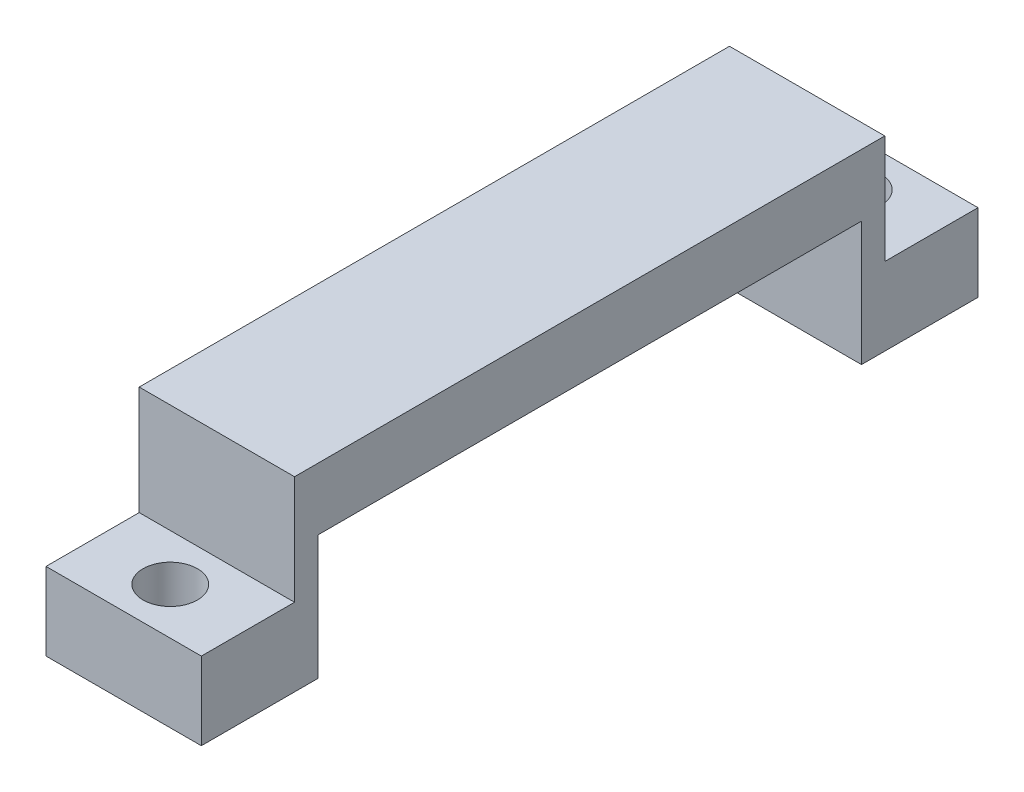
ISO-10303-21;
HEADER;
FILE_DESCRIPTION(('STEP AP214'),'2;1');
FILE_NAME('part.step','',(''),(''),'','','');
FILE_SCHEMA(('AUTOMOTIVE_DESIGN { 1 0 10303 214 1 1 1 1 }'));
ENDSEC;
DATA;
#1=APPLICATION_CONTEXT('core data for automotive mechanical design processes');
#2=APPLICATION_PROTOCOL_DEFINITION('international standard','automotive_design',2000,#1);
#3=PRODUCT_CONTEXT('',#1,'mechanical');
#4=PRODUCT('Part','Part','',(#3));
#5=PRODUCT_RELATED_PRODUCT_CATEGORY('part','',(#4));
#6=PRODUCT_DEFINITION_FORMATION('','',#4);
#7=PRODUCT_DEFINITION_CONTEXT('part definition',#1,'design');
#8=PRODUCT_DEFINITION('design','',#6,#7);
#9=PRODUCT_DEFINITION_SHAPE('','',#8);
#10=(LENGTH_UNIT() NAMED_UNIT(*) SI_UNIT(.MILLI.,.METRE.));
#11=(NAMED_UNIT(*) PLANE_ANGLE_UNIT() SI_UNIT($,.RADIAN.));
#12=(NAMED_UNIT(*) SI_UNIT($,.STERADIAN.) SOLID_ANGLE_UNIT());
#13=UNCERTAINTY_MEASURE_WITH_UNIT(LENGTH_MEASURE(1.E-05),#10,'distance_accuracy_value','');
#14=(GEOMETRIC_REPRESENTATION_CONTEXT(3) GLOBAL_UNCERTAINTY_ASSIGNED_CONTEXT((#13)) GLOBAL_UNIT_ASSIGNED_CONTEXT((#10,
#11,#12)) REPRESENTATION_CONTEXT('',''));
#15=CARTESIAN_POINT('',(0.,0.,0.));
#16=DIRECTION('',(0.,0.,1.));
#17=DIRECTION('',(1.,0.,0.));
#18=AXIS2_PLACEMENT_3D('',#15,#16,#17);
#19=CARTESIAN_POINT('',(20.,12.,25.));
#20=DIRECTION('',(-1.,0.,0.));
#21=DIRECTION('',(0.,0.,1.));
#22=AXIS2_PLACEMENT_3D('',#19,#20,#21);
#23=PLANE('',#22);
#24=DIRECTION('',(0.,1.,0.));
#25=VECTOR('',#24,1.);
#26=CARTESIAN_POINT('',(20.,5.,19.));
#27=LINE('',#26,#25);
#28=CARTESIAN_POINT('',(20.,5.,19.));
#29=VERTEX_POINT('',#28);
#30=CARTESIAN_POINT('',(20.,12.,19.));
#31=VERTEX_POINT('',#30);
#32=EDGE_CURVE('E201',#29,#31,#27,.T.);
#33=ORIENTED_EDGE('',*,*,#32,.F.);
#34=DIRECTION('',(0.,0.,-1.));
#35=VECTOR('',#34,1.);
#36=CARTESIAN_POINT('',(20.,5.,25.));
#37=LINE('',#36,#35);
#38=CARTESIAN_POINT('',(20.,5.,25.));
#39=VERTEX_POINT('',#38);
#40=EDGE_CURVE('E140',#39,#29,#37,.T.);
#41=ORIENTED_EDGE('',*,*,#40,.F.);
#42=DIRECTION('',(0.,-1.,0.));
#43=VECTOR('',#42,1.);
#44=CARTESIAN_POINT('',(20.,12.,25.));
#45=LINE('',#44,#43);
#46=CARTESIAN_POINT('',(20.,0.,25.));
#47=VERTEX_POINT('',#46);
#48=EDGE_CURVE('E139',#39,#47,#45,.T.);
#49=ORIENTED_EDGE('',*,*,#48,.T.);
#50=DIRECTION('',(0.,0.,-1.));
#51=VECTOR('',#50,1.);
#52=CARTESIAN_POINT('',(20.,0.,25.));
#53=LINE('',#52,#51);
#54=CARTESIAN_POINT('',(20.,0.,17.5));
#55=VERTEX_POINT('',#54);
#56=EDGE_CURVE('E177',#47,#55,#53,.T.);
#57=ORIENTED_EDGE('',*,*,#56,.T.);
#58=DIRECTION('',(0.,1.,0.));
#59=VECTOR('',#58,1.);
#60=CARTESIAN_POINT('',(20.,0.,17.5));
#61=LINE('',#60,#59);
#62=CARTESIAN_POINT('',(20.,8.,17.5));
#63=VERTEX_POINT('',#62);
#64=EDGE_CURVE('E160',#55,#63,#61,.T.);
#65=ORIENTED_EDGE('',*,*,#64,.T.);
#66=DIRECTION('',(0.,0.,-1.));
#67=VECTOR('',#66,1.);
#68=CARTESIAN_POINT('',(20.,8.,17.5));
#69=LINE('',#68,#67);
#70=CARTESIAN_POINT('',(20.,8.,-17.5));
#71=VERTEX_POINT('',#70);
#72=EDGE_CURVE('E163',#63,#71,#69,.T.);
#73=ORIENTED_EDGE('',*,*,#72,.T.);
#74=DIRECTION('',(0.,1.,0.));
#75=VECTOR('',#74,1.);
#76=CARTESIAN_POINT('',(20.,0.,-17.5));
#77=LINE('',#76,#75);
#78=CARTESIAN_POINT('',(20.,0.,-17.5));
#79=VERTEX_POINT('',#78);
#80=EDGE_CURVE('E166',#79,#71,#77,.T.);
#81=ORIENTED_EDGE('',*,*,#80,.F.);
#82=CARTESIAN_POINT('',(20.,0.,-25.));
#83=VERTEX_POINT('',#82);
#84=EDGE_CURVE('E173',#79,#83,#53,.T.);
#85=ORIENTED_EDGE('',*,*,#84,.T.);
#86=DIRECTION('',(0.,-1.,0.));
#87=VECTOR('',#86,1.);
#88=CARTESIAN_POINT('',(20.,12.,-25.));
#89=LINE('',#88,#87);
#90=CARTESIAN_POINT('',(20.,5.,-25.));
#91=VERTEX_POINT('',#90);
#92=EDGE_CURVE('E185',#91,#83,#89,.T.);
#93=ORIENTED_EDGE('',*,*,#92,.F.);
#94=DIRECTION('',(0.,0.,1.));
#95=VECTOR('',#94,1.);
#96=CARTESIAN_POINT('',(20.,5.,-25.));
#97=LINE('',#96,#95);
#98=CARTESIAN_POINT('',(20.,5.,-19.));
#99=VERTEX_POINT('',#98);
#100=EDGE_CURVE('E216',#91,#99,#97,.T.);
#101=ORIENTED_EDGE('',*,*,#100,.T.);
#102=DIRECTION('',(0.,1.,0.));
#103=VECTOR('',#102,1.);
#104=CARTESIAN_POINT('',(20.,5.,-19.));
#105=LINE('',#104,#103);
#106=CARTESIAN_POINT('',(20.,12.,-19.));
#107=VERTEX_POINT('',#106);
#108=EDGE_CURVE('E151',#99,#107,#105,.T.);
#109=ORIENTED_EDGE('',*,*,#108,.T.);
#110=DIRECTION('',(0.,0.,-1.));
#111=VECTOR('',#110,1.);
#112=CARTESIAN_POINT('',(20.,12.,25.));
#113=LINE('',#112,#111);
#114=EDGE_CURVE('E174',#31,#107,#113,.T.);
#115=ORIENTED_EDGE('',*,*,#114,.F.);
#116=EDGE_LOOP('',(#33,#41,#49,#57,#65,#73,#81,#85,#93,#101,#109,#115));
#117=FACE_BOUND('',#116,.T.);
#118=ADVANCED_FACE('F33',(#117),#23,.F.);
#119=CARTESIAN_POINT('',(-20.,12.,25.));
#120=DIRECTION('',(0.,0.,-1.));
#121=DIRECTION('',(-1.,0.,0.));
#122=AXIS2_PLACEMENT_3D('',#119,#120,#121);
#123=PLANE('',#122);
#124=DIRECTION('',(1.,0.,0.));
#125=VECTOR('',#124,1.);
#126=CARTESIAN_POINT('',(9.99999999999998,5.,25.));
#127=LINE('',#126,#125);
#128=CARTESIAN_POINT('',(9.99999999999998,5.,25.));
#129=VERTEX_POINT('',#128);
#130=EDGE_CURVE('E125',#129,#39,#127,.T.);
#131=ORIENTED_EDGE('',*,*,#130,.F.);
#132=DIRECTION('',(0.,1.,0.));
#133=VECTOR('',#132,1.);
#134=CARTESIAN_POINT('',(9.99999999999999,-53.,25.));
#135=LINE('',#134,#133);
#136=CARTESIAN_POINT('',(9.99999999999999,0.,25.));
#137=VERTEX_POINT('',#136);
#138=EDGE_CURVE('E137',#137,#129,#135,.T.);
#139=ORIENTED_EDGE('',*,*,#138,.F.);
#140=DIRECTION('',(1.,0.,0.));
#141=VECTOR('',#140,1.);
#142=CARTESIAN_POINT('',(-20.,0.,25.));
#143=LINE('',#142,#141);
#144=EDGE_CURVE('E176',#137,#47,#143,.T.);
#145=ORIENTED_EDGE('',*,*,#144,.T.);
#146=ORIENTED_EDGE('',*,*,#48,.F.);
#147=EDGE_LOOP('',(#131,#139,#145,#146));
#148=FACE_BOUND('',#147,.T.);
#149=ADVANCED_FACE('F135',(#148),#123,.F.);
#150=CARTESIAN_POINT('',(0.,12.,0.));
#151=DIRECTION('',(0.,-1.,0.));
#152=DIRECTION('',(0.,0.,-1.));
#153=AXIS2_PLACEMENT_3D('',#150,#151,#152);
#154=PLANE('',#153);
#155=DIRECTION('',(1.,0.,0.));
#156=VECTOR('',#155,1.);
#157=CARTESIAN_POINT('',(9.99999999999998,12.,19.));
#158=LINE('',#157,#156);
#159=CARTESIAN_POINT('',(9.99999999999998,12.,19.));
#160=VERTEX_POINT('',#159);
#161=EDGE_CURVE('E130',#160,#31,#158,.T.);
#162=ORIENTED_EDGE('',*,*,#161,.T.);
#163=ORIENTED_EDGE('',*,*,#114,.T.);
#164=DIRECTION('',(1.,0.,0.));
#165=VECTOR('',#164,1.);
#166=CARTESIAN_POINT('',(9.99999999999998,12.,-19.));
#167=LINE('',#166,#165);
#168=CARTESIAN_POINT('',(9.99999999999998,12.,-19.));
#169=VERTEX_POINT('',#168);
#170=EDGE_CURVE('E209',#169,#107,#167,.T.);
#171=ORIENTED_EDGE('',*,*,#170,.F.);
#172=DIRECTION('',(0.,0.,-1.));
#173=VECTOR('',#172,1.);
#174=CARTESIAN_POINT('',(9.99999999999998,12.,-25.));
#175=LINE('',#174,#173);
#176=EDGE_CURVE('E146',#160,#169,#175,.T.);
#177=ORIENTED_EDGE('',*,*,#176,.F.);
#178=EDGE_LOOP('',(#162,#163,#171,#177));
#179=FACE_BOUND('',#178,.T.);
#180=ADVANCED_FACE('F232',(#179),#154,.F.);
#181=CARTESIAN_POINT('',(9.99999999999998,-53.,-25.));
#182=DIRECTION('',(1.,0.,0.));
#183=DIRECTION('',(0.,0.,-1.));
#184=AXIS2_PLACEMENT_3D('',#181,#182,#183);
#185=PLANE('',#184);
#186=DIRECTION('',(0.,1.,0.));
#187=VECTOR('',#186,1.);
#188=CARTESIAN_POINT('',(9.99999999999998,5.,19.));
#189=LINE('',#188,#187);
#190=CARTESIAN_POINT('',(9.99999999999999,5.,19.));
#191=VERTEX_POINT('',#190);
#192=EDGE_CURVE('E47',#191,#160,#189,.T.);
#193=ORIENTED_EDGE('',*,*,#192,.T.);
#194=ORIENTED_EDGE('',*,*,#176,.T.);
#195=DIRECTION('',(0.,1.,0.));
#196=VECTOR('',#195,1.);
#197=CARTESIAN_POINT('',(9.99999999999998,5.,-19.));
#198=LINE('',#197,#196);
#199=CARTESIAN_POINT('',(9.99999999999998,5.,-19.));
#200=VERTEX_POINT('',#199);
#201=EDGE_CURVE('E220',#200,#169,#198,.T.);
#202=ORIENTED_EDGE('',*,*,#201,.F.);
#203=DIRECTION('',(0.,0.,1.));
#204=VECTOR('',#203,1.);
#205=CARTESIAN_POINT('',(9.99999999999998,5.,-25.));
#206=LINE('',#205,#204);
#207=CARTESIAN_POINT('',(9.99999999999998,5.,-25.));
#208=VERTEX_POINT('',#207);
#209=EDGE_CURVE('E211',#208,#200,#206,.T.);
#210=ORIENTED_EDGE('',*,*,#209,.F.);
#211=DIRECTION('',(0.,1.,0.));
#212=VECTOR('',#211,1.);
#213=CARTESIAN_POINT('',(9.99999999999998,-53.,-25.));
#214=LINE('',#213,#212);
#215=CARTESIAN_POINT('',(9.99999999999998,0.,-25.));
#216=VERTEX_POINT('',#215);
#217=EDGE_CURVE('E145',#216,#208,#214,.T.);
#218=ORIENTED_EDGE('',*,*,#217,.F.);
#219=DIRECTION('',(0.,0.,1.));
#220=VECTOR('',#219,1.);
#221=CARTESIAN_POINT('',(9.99999999999999,0.,0.));
#222=LINE('',#221,#220);
#223=CARTESIAN_POINT('',(9.99999999999998,0.,-17.5));
#224=VERTEX_POINT('',#223);
#225=EDGE_CURVE('E155',#216,#224,#222,.T.);
#226=ORIENTED_EDGE('',*,*,#225,.T.);
#227=DIRECTION('',(0.,-1.,0.));
#228=VECTOR('',#227,1.);
#229=CARTESIAN_POINT('',(9.99999999999998,0.,-17.5));
#230=LINE('',#229,#228);
#231=CARTESIAN_POINT('',(9.99999999999998,8.,-17.5));
#232=VERTEX_POINT('',#231);
#233=EDGE_CURVE('E11',#232,#224,#230,.T.);
#234=ORIENTED_EDGE('',*,*,#233,.F.);
#235=DIRECTION('',(0.,0.,1.));
#236=VECTOR('',#235,1.);
#237=CARTESIAN_POINT('',(9.99999999999999,8.,17.5));
#238=LINE('',#237,#236);
#239=CARTESIAN_POINT('',(9.99999999999999,8.,17.5));
#240=VERTEX_POINT('',#239);
#241=EDGE_CURVE('E149',#232,#240,#238,.T.);
#242=ORIENTED_EDGE('',*,*,#241,.T.);
#243=DIRECTION('',(0.,-1.,0.));
#244=VECTOR('',#243,1.);
#245=CARTESIAN_POINT('',(9.99999999999999,0.,17.5));
#246=LINE('',#245,#244);
#247=CARTESIAN_POINT('',(9.99999999999999,0.,17.5));
#248=VERTEX_POINT('',#247);
#249=EDGE_CURVE('E157',#240,#248,#246,.T.);
#250=ORIENTED_EDGE('',*,*,#249,.T.);
#251=DIRECTION('',(0.,0.,1.));
#252=VECTOR('',#251,1.);
#253=CARTESIAN_POINT('',(9.99999999999999,0.,0.));
#254=LINE('',#253,#252);
#255=EDGE_CURVE('E144',#248,#137,#254,.T.);
#256=ORIENTED_EDGE('',*,*,#255,.T.);
#257=ORIENTED_EDGE('',*,*,#138,.T.);
#258=DIRECTION('',(0.,0.,-1.));
#259=VECTOR('',#258,1.);
#260=CARTESIAN_POINT('',(9.99999999999998,5.,25.));
#261=LINE('',#260,#259);
#262=EDGE_CURVE('E121',#129,#191,#261,.T.);
#263=ORIENTED_EDGE('',*,*,#262,.T.);
#264=EDGE_LOOP('',(#193,#194,#202,#210,#218,#226,#234,#242,#250,#256,#257,#263));
#265=FACE_BOUND('',#264,.T.);
#266=ADVANCED_FACE('F142',(#265),#185,.F.);
#267=CARTESIAN_POINT('',(-20.,12.,-25.));
#268=DIRECTION('',(0.,0.,1.));
#269=DIRECTION('',(1.,0.,0.));
#270=AXIS2_PLACEMENT_3D('',#267,#268,#269);
#271=PLANE('',#270);
#272=DIRECTION('',(1.,0.,0.));
#273=VECTOR('',#272,1.);
#274=CARTESIAN_POINT('',(9.99999999999998,5.,-25.));
#275=LINE('',#274,#273);
#276=EDGE_CURVE('E55',#208,#91,#275,.T.);
#277=ORIENTED_EDGE('',*,*,#276,.T.);
#278=ORIENTED_EDGE('',*,*,#92,.T.);
#279=DIRECTION('',(-1.,0.,0.));
#280=VECTOR('',#279,1.);
#281=CARTESIAN_POINT('',(-20.,0.,-25.));
#282=LINE('',#281,#280);
#283=EDGE_CURVE('E180',#83,#216,#282,.T.);
#284=ORIENTED_EDGE('',*,*,#283,.T.);
#285=ORIENTED_EDGE('',*,*,#217,.T.);
#286=EDGE_LOOP('',(#277,#278,#284,#285));
#287=FACE_BOUND('',#286,.T.);
#288=ADVANCED_FACE('F237',(#287),#271,.F.);
#289=CARTESIAN_POINT('',(0.,0.,0.));
#290=DIRECTION('',(0.,-1.,0.));
#291=DIRECTION('',(0.,0.,-1.));
#292=AXIS2_PLACEMENT_3D('',#289,#290,#291);
#293=PLANE('',#292);
#294=CARTESIAN_POINT('',(15.,0.,22.));
#295=DIRECTION('',(0.,-1.,0.));
#296=DIRECTION('',(0.,0.,-1.));
#297=AXIS2_PLACEMENT_3D('',#294,#295,#296);
#298=CIRCLE('',#297,1.75);
#299=CARTESIAN_POINT('',(15.,0.,20.25));
#300=VERTEX_POINT('',#299);
#301=EDGE_CURVE('E311',#300,#300,#298,.F.);
#302=ORIENTED_EDGE('',*,*,#301,.T.);
#303=EDGE_LOOP('',(#302));
#304=FACE_BOUND('',#303,.T.);
#305=ORIENTED_EDGE('',*,*,#255,.F.);
#306=DIRECTION('',(1.,0.,0.));
#307=VECTOR('',#306,1.);
#308=CARTESIAN_POINT('',(0.,0.,17.5));
#309=LINE('',#308,#307);
#310=EDGE_CURVE('E40',#248,#55,#309,.T.);
#311=ORIENTED_EDGE('',*,*,#310,.T.);
#312=ORIENTED_EDGE('',*,*,#56,.F.);
#313=ORIENTED_EDGE('',*,*,#144,.F.);
#314=EDGE_LOOP('',(#305,#311,#312,#313));
#315=FACE_BOUND('',#314,.T.);
#316=ADVANCED_FACE('F192',(#304,#315),#293,.T.);
#317=CARTESIAN_POINT('',(15.,0.,-22.));
#318=DIRECTION('',(0.,-1.,0.));
#319=DIRECTION('',(0.,0.,-1.));
#320=AXIS2_PLACEMENT_3D('',#317,#318,#319);
#321=CIRCLE('',#320,1.75);
#322=CARTESIAN_POINT('',(15.,0.,-23.75));
#323=VERTEX_POINT('',#322);
#324=EDGE_CURVE('E207',#323,#323,#321,.T.);
#325=ORIENTED_EDGE('',*,*,#324,.F.);
#326=EDGE_LOOP('',(#325));
#327=FACE_BOUND('',#326,.T.);
#328=ORIENTED_EDGE('',*,*,#225,.F.);
#329=ORIENTED_EDGE('',*,*,#283,.F.);
#330=ORIENTED_EDGE('',*,*,#84,.F.);
#331=DIRECTION('',(1.,0.,0.));
#332=VECTOR('',#331,1.);
#333=CARTESIAN_POINT('',(0.,0.,-17.5));
#334=LINE('',#333,#332);
#335=EDGE_CURVE('E187',#224,#79,#334,.T.);
#336=ORIENTED_EDGE('',*,*,#335,.F.);
#337=EDGE_LOOP('',(#328,#329,#330,#336));
#338=FACE_BOUND('',#337,.T.);
#339=ADVANCED_FACE('F242',(#327,#338),#293,.T.);
#340=CARTESIAN_POINT('',(-45.,8.,17.5));
#341=DIRECTION('',(0.,-1.,0.));
#342=DIRECTION('',(0.,0.,-1.));
#343=AXIS2_PLACEMENT_3D('',#340,#341,#342);
#344=PLANE('',#343);
#345=ORIENTED_EDGE('',*,*,#241,.F.);
#346=DIRECTION('',(1.,0.,0.));
#347=VECTOR('',#346,1.);
#348=CARTESIAN_POINT('',(-45.,8.,-17.5));
#349=LINE('',#348,#347);
#350=EDGE_CURVE('E169',#232,#71,#349,.T.);
#351=ORIENTED_EDGE('',*,*,#350,.T.);
#352=ORIENTED_EDGE('',*,*,#72,.F.);
#353=DIRECTION('',(1.,0.,0.));
#354=VECTOR('',#353,1.);
#355=CARTESIAN_POINT('',(-45.,8.,17.5));
#356=LINE('',#355,#354);
#357=EDGE_CURVE('E171',#240,#63,#356,.T.);
#358=ORIENTED_EDGE('',*,*,#357,.F.);
#359=EDGE_LOOP('',(#345,#351,#352,#358));
#360=FACE_BOUND('',#359,.T.);
#361=ADVANCED_FACE('F250',(#360),#344,.T.);
#362=CARTESIAN_POINT('',(-45.,0.,17.5));
#363=DIRECTION('',(0.,0.,-1.));
#364=DIRECTION('',(-1.,0.,0.));
#365=AXIS2_PLACEMENT_3D('',#362,#363,#364);
#366=PLANE('',#365);
#367=ORIENTED_EDGE('',*,*,#249,.F.);
#368=ORIENTED_EDGE('',*,*,#357,.T.);
#369=ORIENTED_EDGE('',*,*,#64,.F.);
#370=ORIENTED_EDGE('',*,*,#310,.F.);
#371=EDGE_LOOP('',(#367,#368,#369,#370));
#372=FACE_BOUND('',#371,.T.);
#373=ADVANCED_FACE('F195',(#372),#366,.T.);
#374=CARTESIAN_POINT('',(-45.,0.,-17.5));
#375=DIRECTION('',(0.,0.,-1.));
#376=DIRECTION('',(-1.,0.,0.));
#377=AXIS2_PLACEMENT_3D('',#374,#375,#376);
#378=PLANE('',#377);
#379=ORIENTED_EDGE('',*,*,#350,.F.);
#380=ORIENTED_EDGE('',*,*,#233,.T.);
#381=ORIENTED_EDGE('',*,*,#335,.T.);
#382=ORIENTED_EDGE('',*,*,#80,.T.);
#383=EDGE_LOOP('',(#379,#380,#381,#382));
#384=FACE_BOUND('',#383,.T.);
#385=ADVANCED_FACE('F247',(#384),#378,.F.);
#386=CARTESIAN_POINT('',(9.99999999999998,5.,-19.));
#387=DIRECTION('',(0.,0.,1.));
#388=DIRECTION('',(1.,0.,0.));
#389=AXIS2_PLACEMENT_3D('',#386,#387,#388);
#390=PLANE('',#389);
#391=ORIENTED_EDGE('',*,*,#170,.T.);
#392=ORIENTED_EDGE('',*,*,#108,.F.);
#393=DIRECTION('',(1.,0.,0.));
#394=VECTOR('',#393,1.);
#395=CARTESIAN_POINT('',(9.99999999999998,5.,-19.));
#396=LINE('',#395,#394);
#397=EDGE_CURVE('E213',#200,#99,#396,.T.);
#398=ORIENTED_EDGE('',*,*,#397,.F.);
#399=ORIENTED_EDGE('',*,*,#201,.T.);
#400=EDGE_LOOP('',(#391,#392,#398,#399));
#401=FACE_BOUND('',#400,.T.);
#402=ADVANCED_FACE('F229',(#401),#390,.F.);
#403=CARTESIAN_POINT('',(0.,5.,0.));
#404=DIRECTION('',(0.,1.,0.));
#405=DIRECTION('',(0.,0.,1.));
#406=AXIS2_PLACEMENT_3D('',#403,#404,#405);
#407=PLANE('',#406);
#408=CARTESIAN_POINT('',(15.,5.,-22.));
#409=DIRECTION('',(0.,1.,0.));
#410=DIRECTION('',(0.,0.,1.));
#411=AXIS2_PLACEMENT_3D('',#408,#409,#410);
#412=CIRCLE('',#411,1.75);
#413=CARTESIAN_POINT('',(15.,5.,-20.25));
#414=VERTEX_POINT('',#413);
#415=EDGE_CURVE('E316',#414,#414,#412,.T.);
#416=ORIENTED_EDGE('',*,*,#415,.F.);
#417=EDGE_LOOP('',(#416));
#418=FACE_BOUND('',#417,.T.);
#419=ORIENTED_EDGE('',*,*,#209,.T.);
#420=ORIENTED_EDGE('',*,*,#397,.T.);
#421=ORIENTED_EDGE('',*,*,#100,.F.);
#422=ORIENTED_EDGE('',*,*,#276,.F.);
#423=EDGE_LOOP('',(#419,#420,#421,#422));
#424=FACE_BOUND('',#423,.T.);
#425=ADVANCED_FACE('F234',(#418,#424),#407,.T.);
#426=CARTESIAN_POINT('',(9.99999999999998,5.,19.));
#427=DIRECTION('',(0.,0.,1.));
#428=DIRECTION('',(1.,0.,0.));
#429=AXIS2_PLACEMENT_3D('',#426,#427,#428);
#430=PLANE('',#429);
#431=ORIENTED_EDGE('',*,*,#161,.F.);
#432=ORIENTED_EDGE('',*,*,#192,.F.);
#433=DIRECTION('',(1.,0.,0.));
#434=VECTOR('',#433,1.);
#435=CARTESIAN_POINT('',(9.99999999999998,5.,19.));
#436=LINE('',#435,#434);
#437=EDGE_CURVE('E127',#191,#29,#436,.T.);
#438=ORIENTED_EDGE('',*,*,#437,.T.);
#439=ORIENTED_EDGE('',*,*,#32,.T.);
#440=EDGE_LOOP('',(#431,#432,#438,#439));
#441=FACE_BOUND('',#440,.T.);
#442=ADVANCED_FACE('F288',(#441),#430,.T.);
#443=CARTESIAN_POINT('',(0.,5.,0.));
#444=DIRECTION('',(0.,1.,0.));
#445=DIRECTION('',(0.,0.,-1.));
#446=AXIS2_PLACEMENT_3D('',#443,#444,#445);
#447=PLANE('',#446);
#448=CARTESIAN_POINT('',(15.,5.,22.));
#449=DIRECTION('',(0.,-1.,0.));
#450=DIRECTION('',(0.,0.,-1.));
#451=AXIS2_PLACEMENT_3D('',#448,#449,#450);
#452=CIRCLE('',#451,1.75);
#453=CARTESIAN_POINT('',(15.,5.,20.25));
#454=VERTEX_POINT('',#453);
#455=EDGE_CURVE('E314',#454,#454,#452,.T.);
#456=ORIENTED_EDGE('',*,*,#455,.T.);
#457=EDGE_LOOP('',(#456));
#458=FACE_BOUND('',#457,.T.);
#459=ORIENTED_EDGE('',*,*,#262,.F.);
#460=ORIENTED_EDGE('',*,*,#130,.T.);
#461=ORIENTED_EDGE('',*,*,#40,.T.);
#462=ORIENTED_EDGE('',*,*,#437,.F.);
#463=EDGE_LOOP('',(#459,#460,#461,#462));
#464=FACE_BOUND('',#463,.T.);
#465=ADVANCED_FACE('F123',(#458,#464),#447,.T.);
#466=CARTESIAN_POINT('',(15.,-2.,-22.));
#467=DIRECTION('',(0.,1.,0.));
#468=DIRECTION('',(0.,0.,1.));
#469=AXIS2_PLACEMENT_3D('',#466,#467,#468);
#470=CYLINDRICAL_SURFACE('',#469,1.75);
#471=ORIENTED_EDGE('',*,*,#324,.T.);
#472=EDGE_LOOP('',(#471));
#473=FACE_BOUND('',#472,.T.);
#474=ORIENTED_EDGE('',*,*,#415,.T.);
#475=EDGE_LOOP('',(#474));
#476=FACE_BOUND('',#475,.T.);
#477=ADVANCED_FACE('F298',(#473,#476),#470,.F.);
#478=CARTESIAN_POINT('',(15.,-2.,22.));
#479=DIRECTION('',(0.,1.,0.));
#480=DIRECTION('',(0.,0.,1.));
#481=AXIS2_PLACEMENT_3D('',#478,#479,#480);
#482=CYLINDRICAL_SURFACE('',#481,1.75);
#483=ORIENTED_EDGE('',*,*,#301,.F.);
#484=EDGE_LOOP('',(#483));
#485=FACE_BOUND('',#484,.T.);
#486=ORIENTED_EDGE('',*,*,#455,.F.);
#487=EDGE_LOOP('',(#486));
#488=FACE_BOUND('',#487,.T.);
#489=ADVANCED_FACE('F302',(#485,#488),#482,.F.);
#490=CLOSED_SHELL('',(#118,#149,#180,#266,#288,#316,#339,#361,#373,#385,#402,#425,#442,#465,
#477,#489));
#491=MANIFOLD_SOLID_BREP('B2',#490);
#492=ADVANCED_BREP_SHAPE_REPRESENTATION('',(#18,#491),#14);
#493=SHAPE_DEFINITION_REPRESENTATION(#9,#492);
ENDSEC;
END-ISO-10303-21;
